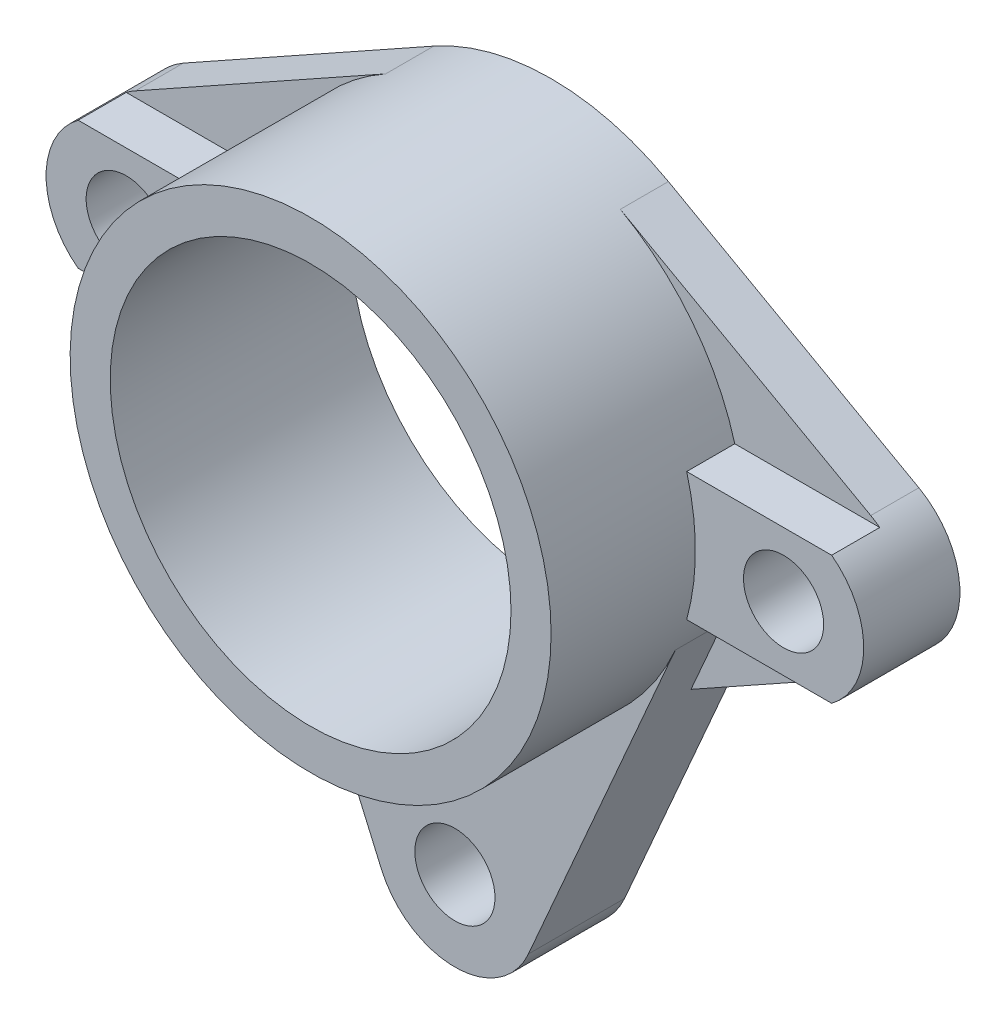
ISO-10303-21;
HEADER;
FILE_DESCRIPTION(('STEP AP214'),'2;1');
FILE_NAME('part.step','',(''),(''),'','','');
FILE_SCHEMA(('AUTOMOTIVE_DESIGN { 1 0 10303 214 1 1 1 1 }'));
ENDSEC;
DATA;
#1=APPLICATION_CONTEXT('core data for automotive mechanical design processes');
#2=APPLICATION_PROTOCOL_DEFINITION('international standard','automotive_design',2000,#1);
#3=PRODUCT_CONTEXT('',#1,'mechanical');
#4=PRODUCT('Part','Part','',(#3));
#5=PRODUCT_RELATED_PRODUCT_CATEGORY('part','',(#4));
#6=PRODUCT_DEFINITION_FORMATION('','',#4);
#7=PRODUCT_DEFINITION_CONTEXT('part definition',#1,'design');
#8=PRODUCT_DEFINITION('design','',#6,#7);
#9=PRODUCT_DEFINITION_SHAPE('','',#8);
#10=(LENGTH_UNIT() NAMED_UNIT(*) SI_UNIT(.MILLI.,.METRE.));
#11=(NAMED_UNIT(*) PLANE_ANGLE_UNIT() SI_UNIT($,.RADIAN.));
#12=(NAMED_UNIT(*) SI_UNIT($,.STERADIAN.) SOLID_ANGLE_UNIT());
#13=UNCERTAINTY_MEASURE_WITH_UNIT(LENGTH_MEASURE(1.E-05),#10,'distance_accuracy_value','');
#14=(GEOMETRIC_REPRESENTATION_CONTEXT(3) GLOBAL_UNCERTAINTY_ASSIGNED_CONTEXT((#13)) GLOBAL_UNIT_ASSIGNED_CONTEXT((#10,
#11,#12)) REPRESENTATION_CONTEXT('',''));
#15=CARTESIAN_POINT('',(0.,0.,0.));
#16=DIRECTION('',(0.,0.,1.));
#17=DIRECTION('',(1.,0.,0.));
#18=AXIS2_PLACEMENT_3D('',#15,#16,#17);
#19=CARTESIAN_POINT('',(0.,8.,12.));
#20=DIRECTION('',(0.,-1.,0.));
#21=DIRECTION('',(0.,0.,-1.));
#22=AXIS2_PLACEMENT_3D('',#19,#20,#21);
#23=PLANE('',#22);
#24=DIRECTION('',(0.,0.,-1.));
#25=VECTOR('',#24,1.);
#26=CARTESIAN_POINT('',(-28.9136645896019,8.,12.));
#27=LINE('',#26,#25);
#28=CARTESIAN_POINT('',(-28.9136645896019,8.,12.));
#29=VERTEX_POINT('',#28);
#30=CARTESIAN_POINT('',(-28.9136645896019,8.,6.));
#31=VERTEX_POINT('',#30);
#32=EDGE_CURVE('E403',#29,#31,#27,.T.);
#33=ORIENTED_EDGE('',*,*,#32,.T.);
#34=DIRECTION('',(-1.,0.,0.));
#35=VECTOR('',#34,1.);
#36=CARTESIAN_POINT('',(0.,8.,6.));
#37=LINE('',#36,#35);
#38=CARTESIAN_POINT('',(-47.,8.,6.));
#39=VERTEX_POINT('',#38);
#40=EDGE_CURVE('E288',#31,#39,#37,.T.);
#41=ORIENTED_EDGE('',*,*,#40,.T.);
#42=DIRECTION('',(0.,0.,-1.));
#43=VECTOR('',#42,1.);
#44=CARTESIAN_POINT('',(-47.,8.,12.));
#45=LINE('',#44,#43);
#46=CARTESIAN_POINT('',(-47.,8.,12.));
#47=VERTEX_POINT('',#46);
#48=EDGE_CURVE('E11',#47,#39,#45,.T.);
#49=ORIENTED_EDGE('',*,*,#48,.F.);
#50=DIRECTION('',(-1.,0.,0.));
#51=VECTOR('',#50,1.);
#52=CARTESIAN_POINT('',(0.,8.,12.));
#53=LINE('',#52,#51);
#54=EDGE_CURVE('E387',#29,#47,#53,.T.);
#55=ORIENTED_EDGE('',*,*,#54,.F.);
#56=EDGE_LOOP('',(#33,#41,#49,#55));
#57=FACE_BOUND('',#56,.T.);
#58=ADVANCED_FACE('F41',(#57),#23,.F.);
#59=CARTESIAN_POINT('',(-41.,0.,12.));
#60=DIRECTION('',(0.,0.,-1.));
#61=DIRECTION('',(-1.,0.,0.));
#62=AXIS2_PLACEMENT_3D('',#59,#60,#61);
#63=CYLINDRICAL_SURFACE('',#62,10.);
#64=CARTESIAN_POINT('',(-41.,0.,0.));
#65=DIRECTION('',(0.,0.,1.));
#66=DIRECTION('',(1.,0.,0.));
#67=AXIS2_PLACEMENT_3D('',#64,#65,#66);
#68=CIRCLE('',#67,10.);
#69=CARTESIAN_POINT('',(-45.8780487804878,8.72952691130404,0.));
#70=VERTEX_POINT('',#69);
#71=CARTESIAN_POINT('',(-45.8780487804878,-8.72952691130405,0.));
#72=VERTEX_POINT('',#71);
#73=EDGE_CURVE('E388',#70,#72,#68,.T.);
#74=ORIENTED_EDGE('',*,*,#73,.T.);
#75=DIRECTION('',(0.,0.,-1.));
#76=VECTOR('',#75,1.);
#77=CARTESIAN_POINT('',(-45.8780487804878,-8.72952691130405,6.));
#78=LINE('',#77,#76);
#79=CARTESIAN_POINT('',(-45.8780487804878,-8.72952691130405,6.));
#80=VERTEX_POINT('',#79);
#81=EDGE_CURVE('E378',#80,#72,#78,.T.);
#82=ORIENTED_EDGE('',*,*,#81,.F.);
#83=CARTESIAN_POINT('',(-41.,0.,6.));
#84=DIRECTION('',(0.,0.,1.));
#85=DIRECTION('',(1.,0.,0.));
#86=AXIS2_PLACEMENT_3D('',#83,#84,#85);
#87=CIRCLE('',#86,10.);
#88=CARTESIAN_POINT('',(-47.,-8.,6.));
#89=VERTEX_POINT('',#88);
#90=EDGE_CURVE('E357',#89,#80,#87,.T.);
#91=ORIENTED_EDGE('',*,*,#90,.F.);
#92=DIRECTION('',(0.,0.,-1.));
#93=VECTOR('',#92,1.);
#94=CARTESIAN_POINT('',(-47.,-8.,12.));
#95=LINE('',#94,#93);
#96=CARTESIAN_POINT('',(-47.,-8.,12.));
#97=VERTEX_POINT('',#96);
#98=EDGE_CURVE('E50',#97,#89,#95,.T.);
#99=ORIENTED_EDGE('',*,*,#98,.F.);
#100=CARTESIAN_POINT('',(-41.,0.,12.));
#101=DIRECTION('',(0.,0.,1.));
#102=DIRECTION('',(1.,0.,0.));
#103=AXIS2_PLACEMENT_3D('',#100,#101,#102);
#104=CIRCLE('',#103,10.);
#105=EDGE_CURVE('E392',#47,#97,#104,.T.);
#106=ORIENTED_EDGE('',*,*,#105,.F.);
#107=ORIENTED_EDGE('',*,*,#48,.T.);
#108=CARTESIAN_POINT('',(-41.,0.,6.));
#109=DIRECTION('',(0.,0.,1.));
#110=DIRECTION('',(1.,0.,0.));
#111=AXIS2_PLACEMENT_3D('',#108,#109,#110);
#112=CIRCLE('',#111,10.);
#113=CARTESIAN_POINT('',(-45.8780487804878,8.72952691130404,6.));
#114=VERTEX_POINT('',#113);
#115=EDGE_CURVE('E284',#114,#39,#112,.T.);
#116=ORIENTED_EDGE('',*,*,#115,.F.);
#117=DIRECTION('',(0.,0.,-1.));
#118=VECTOR('',#117,1.);
#119=CARTESIAN_POINT('',(-45.8780487804878,8.72952691130404,6.));
#120=LINE('',#119,#118);
#121=EDGE_CURVE('E301',#114,#70,#120,.T.);
#122=ORIENTED_EDGE('',*,*,#121,.T.);
#123=EDGE_LOOP('',(#74,#82,#91,#99,#106,#107,#116,#122));
#124=FACE_BOUND('',#123,.T.);
#125=ADVANCED_FACE('F423',(#124),#63,.T.);
#126=CARTESIAN_POINT('',(0.,-8.,12.));
#127=DIRECTION('',(0.,-1.,0.));
#128=DIRECTION('',(1.,0.,0.));
#129=AXIS2_PLACEMENT_3D('',#126,#127,#128);
#130=PLANE('',#129);
#131=DIRECTION('',(-1.,0.,0.));
#132=VECTOR('',#131,1.);
#133=CARTESIAN_POINT('',(0.,-8.,6.));
#134=LINE('',#133,#132);
#135=CARTESIAN_POINT('',(-28.9136645896019,-8.,6.));
#136=VERTEX_POINT('',#135);
#137=EDGE_CURVE('E353',#136,#89,#134,.T.);
#138=ORIENTED_EDGE('',*,*,#137,.F.);
#139=DIRECTION('',(0.,0.,-1.));
#140=VECTOR('',#139,1.);
#141=CARTESIAN_POINT('',(-28.9136645896019,-8.,12.));
#142=LINE('',#141,#140);
#143=CARTESIAN_POINT('',(-28.9136645896019,-8.,12.));
#144=VERTEX_POINT('',#143);
#145=EDGE_CURVE('E411',#144,#136,#142,.T.);
#146=ORIENTED_EDGE('',*,*,#145,.F.);
#147=DIRECTION('',(-1.,0.,0.));
#148=VECTOR('',#147,1.);
#149=CARTESIAN_POINT('',(0.,-8.,12.));
#150=LINE('',#149,#148);
#151=EDGE_CURVE('E395',#144,#97,#150,.T.);
#152=ORIENTED_EDGE('',*,*,#151,.T.);
#153=ORIENTED_EDGE('',*,*,#98,.T.);
#154=EDGE_LOOP('',(#138,#146,#152,#153));
#155=FACE_BOUND('',#154,.T.);
#156=ADVANCED_FACE('F418',(#155),#130,.T.);
#157=CARTESIAN_POINT('',(-41.,0.,12.));
#158=DIRECTION('',(0.,0.,-1.));
#159=DIRECTION('',(-1.,0.,0.));
#160=AXIS2_PLACEMENT_3D('',#157,#158,#159);
#161=CYLINDRICAL_SURFACE('',#160,5.);
#162=CARTESIAN_POINT('',(-41.,0.,12.));
#163=DIRECTION('',(0.,0.,1.));
#164=DIRECTION('',(1.,0.,0.));
#165=AXIS2_PLACEMENT_3D('',#162,#163,#164);
#166=CIRCLE('',#165,5.);
#167=CARTESIAN_POINT('',(-36.,0.,12.));
#168=VERTEX_POINT('',#167);
#169=EDGE_CURVE('E383',#168,#168,#166,.T.);
#170=ORIENTED_EDGE('',*,*,#169,.T.);
#171=EDGE_LOOP('',(#170));
#172=FACE_BOUND('',#171,.T.);
#173=CARTESIAN_POINT('',(-41.,0.,0.));
#174=DIRECTION('',(0.,0.,1.));
#175=DIRECTION('',(1.,0.,0.));
#176=AXIS2_PLACEMENT_3D('',#173,#174,#175);
#177=CIRCLE('',#176,5.);
#178=CARTESIAN_POINT('',(-36.,0.,0.));
#179=VERTEX_POINT('',#178);
#180=EDGE_CURVE('E382',#179,#179,#177,.T.);
#181=ORIENTED_EDGE('',*,*,#180,.F.);
#182=EDGE_LOOP('',(#181));
#183=FACE_BOUND('',#182,.T.);
#184=ADVANCED_FACE('F43',(#172,#183),#161,.F.);
#185=CARTESIAN_POINT('',(0.,0.,12.));
#186=DIRECTION('',(0.,0.,1.));
#187=DIRECTION('',(1.,0.,0.));
#188=AXIS2_PLACEMENT_3D('',#185,#186,#187);
#189=PLANE('',#188);
#190=ORIENTED_EDGE('',*,*,#169,.F.);
#191=EDGE_LOOP('',(#190));
#192=FACE_BOUND('',#191,.T.);
#193=ORIENTED_EDGE('',*,*,#54,.T.);
#194=ORIENTED_EDGE('',*,*,#105,.T.);
#195=ORIENTED_EDGE('',*,*,#151,.F.);
#196=CARTESIAN_POINT('',(0.,0.,12.));
#197=DIRECTION('',(0.,0.,1.));
#198=DIRECTION('',(1.,0.,0.));
#199=AXIS2_PLACEMENT_3D('',#196,#197,#198);
#200=CIRCLE('',#199,30.);
#201=EDGE_CURVE('E399',#29,#144,#200,.T.);
#202=ORIENTED_EDGE('',*,*,#201,.F.);
#203=EDGE_LOOP('',(#193,#194,#195,#202));
#204=FACE_BOUND('',#203,.T.);
#205=ADVANCED_FACE('F431',(#192,#204),#189,.T.);
#206=CARTESIAN_POINT('',(0.,0.,0.));
#207=DIRECTION('',(0.,0.,1.));
#208=DIRECTION('',(1.,0.,0.));
#209=AXIS2_PLACEMENT_3D('',#206,#207,#208);
#210=PLANE('',#209);
#211=ORIENTED_EDGE('',*,*,#180,.T.);
#212=EDGE_LOOP('',(#211));
#213=FACE_BOUND('',#212,.T.);
#214=ORIENTED_EDGE('',*,*,#73,.F.);
#215=DIRECTION('',(0.872952691130404,0.48780487804878,0.));
#216=VECTOR('',#215,1.);
#217=CARTESIAN_POINT('',(-14.6341463414634,26.1885807339121,0.));
#218=LINE('',#217,#216);
#219=CARTESIAN_POINT('',(-14.6341463414634,26.1885807339121,0.));
#220=VERTEX_POINT('',#219);
#221=EDGE_CURVE('E280',#70,#220,#218,.T.);
#222=ORIENTED_EDGE('',*,*,#221,.T.);
#223=CARTESIAN_POINT('',(0.,0.,0.));
#224=DIRECTION('',(0.,0.,1.));
#225=DIRECTION('',(1.,0.,0.));
#226=AXIS2_PLACEMENT_3D('',#223,#224,#225);
#227=CIRCLE('',#226,30.);
#228=CARTESIAN_POINT('',(14.6341463414634,26.1885807339121,0.));
#229=VERTEX_POINT('',#228);
#230=EDGE_CURVE('E701',#229,#220,#227,.T.);
#231=ORIENTED_EDGE('',*,*,#230,.F.);
#232=DIRECTION('',(-0.872952691130404,0.48780487804878,0.));
#233=VECTOR('',#232,1.);
#234=CARTESIAN_POINT('',(14.6341463414634,26.1885807339121,0.));
#235=LINE('',#234,#233);
#236=CARTESIAN_POINT('',(45.8780487804878,8.72952691130405,0.));
#237=VERTEX_POINT('',#236);
#238=EDGE_CURVE('E185',#237,#229,#235,.T.);
#239=ORIENTED_EDGE('',*,*,#238,.F.);
#240=CARTESIAN_POINT('',(41.,0.,0.));
#241=DIRECTION('',(0.,0.,1.));
#242=DIRECTION('',(1.,0.,0.));
#243=AXIS2_PLACEMENT_3D('',#240,#241,#242);
#244=CIRCLE('',#243,10.);
#245=CARTESIAN_POINT('',(45.8780487804878,-8.72952691130403,0.));
#246=VERTEX_POINT('',#245);
#247=EDGE_CURVE('E257',#246,#237,#244,.T.);
#248=ORIENTED_EDGE('',*,*,#247,.F.);
#249=DIRECTION('',(-0.872952691130404,-0.487804878048781,0.));
#250=VECTOR('',#249,1.);
#251=CARTESIAN_POINT('',(14.6341463414634,-26.1885807339121,0.));
#252=LINE('',#251,#250);
#253=CARTESIAN_POINT('',(23.4540446443424,-21.2600325322137,0.));
#254=VERTEX_POINT('',#253);
#255=EDGE_CURVE('E252',#246,#254,#252,.T.);
#256=ORIENTED_EDGE('',*,*,#255,.T.);
#257=DIRECTION('',(0.4,0.916515138991168,0.));
#258=VECTOR('',#257,1.);
#259=CARTESIAN_POINT('',(27.495454169735,-12.,0.));
#260=LINE('',#259,#258);
#261=CARTESIAN_POINT('',(9.16515138991168,-54.,0.));
#262=VERTEX_POINT('',#261);
#263=EDGE_CURVE('E311',#262,#254,#260,.T.);
#264=ORIENTED_EDGE('',*,*,#263,.F.);
#265=CARTESIAN_POINT('',(0.,-50.,0.));
#266=DIRECTION('',(0.,0.,1.));
#267=DIRECTION('',(1.,0.,0.));
#268=AXIS2_PLACEMENT_3D('',#265,#266,#267);
#269=CIRCLE('',#268,10.);
#270=CARTESIAN_POINT('',(-9.16515138991168,-54.,0.));
#271=VERTEX_POINT('',#270);
#272=EDGE_CURVE('E333',#271,#262,#269,.T.);
#273=ORIENTED_EDGE('',*,*,#272,.F.);
#274=DIRECTION('',(-0.4,0.916515138991168,0.));
#275=VECTOR('',#274,1.);
#276=CARTESIAN_POINT('',(-27.495454169735,-12.,0.));
#277=LINE('',#276,#275);
#278=CARTESIAN_POINT('',(-23.4540446443424,-21.2600325322138,0.));
#279=VERTEX_POINT('',#278);
#280=EDGE_CURVE('E329',#271,#279,#277,.T.);
#281=ORIENTED_EDGE('',*,*,#280,.T.);
#282=DIRECTION('',(0.872952691130404,-0.487804878048781,0.));
#283=VECTOR('',#282,1.);
#284=CARTESIAN_POINT('',(-14.6341463414634,-26.1885807339121,0.));
#285=LINE('',#284,#283);
#286=EDGE_CURVE('E352',#72,#279,#285,.T.);
#287=ORIENTED_EDGE('',*,*,#286,.F.);
#288=EDGE_LOOP('',(#214,#222,#231,#239,#248,#256,#264,#273,#281,#287));
#289=FACE_BOUND('',#288,.T.);
#290=CARTESIAN_POINT('',(0.,-50.,0.));
#291=DIRECTION('',(0.,0.,1.));
#292=DIRECTION('',(1.,0.,0.));
#293=AXIS2_PLACEMENT_3D('',#290,#291,#292);
#294=CIRCLE('',#293,5.);
#295=CARTESIAN_POINT('',(5.00000000000001,-50.,0.));
#296=VERTEX_POINT('',#295);
#297=EDGE_CURVE('E305',#296,#296,#294,.T.);
#298=ORIENTED_EDGE('',*,*,#297,.T.);
#299=EDGE_LOOP('',(#298));
#300=FACE_BOUND('',#299,.T.);
#301=CARTESIAN_POINT('',(41.,0.,0.));
#302=DIRECTION('',(0.,0.,1.));
#303=DIRECTION('',(1.,0.,0.));
#304=AXIS2_PLACEMENT_3D('',#301,#302,#303);
#305=CIRCLE('',#304,5.);
#306=CARTESIAN_POINT('',(46.,0.,0.));
#307=VERTEX_POINT('',#306);
#308=EDGE_CURVE('E216',#307,#307,#305,.T.);
#309=ORIENTED_EDGE('',*,*,#308,.T.);
#310=EDGE_LOOP('',(#309));
#311=FACE_BOUND('',#310,.T.);
#312=CARTESIAN_POINT('',(0.,0.,0.));
#313=DIRECTION('',(0.,0.,1.));
#314=DIRECTION('',(1.,0.,0.));
#315=AXIS2_PLACEMENT_3D('',#312,#313,#314);
#316=CIRCLE('',#315,25.);
#317=CARTESIAN_POINT('',(25.,0.,0.));
#318=VERTEX_POINT('',#317);
#319=EDGE_CURVE('E698',#318,#318,#316,.T.);
#320=ORIENTED_EDGE('',*,*,#319,.T.);
#321=EDGE_LOOP('',(#320));
#322=FACE_BOUND('',#321,.T.);
#323=ADVANCED_FACE('F449',(#213,#289,#300,#311,#322),#210,.F.);
#324=CARTESIAN_POINT('',(-14.6341463414634,-26.1885807339121,6.));
#325=DIRECTION('',(0.487804878048781,0.872952691130404,0.));
#326=DIRECTION('',(-0.872952691130404,0.487804878048781,0.));
#327=AXIS2_PLACEMENT_3D('',#324,#325,#326);
#328=PLANE('',#327);
#329=ORIENTED_EDGE('',*,*,#286,.T.);
#330=DIRECTION('',(0.,0.,-1.));
#331=VECTOR('',#330,1.);
#332=CARTESIAN_POINT('',(-23.4540446443424,-21.2600325322138,6.));
#333=LINE('',#332,#331);
#334=CARTESIAN_POINT('',(-23.4540446443424,-21.2600325322138,6.));
#335=VERTEX_POINT('',#334);
#336=EDGE_CURVE('E372',#335,#279,#333,.T.);
#337=ORIENTED_EDGE('',*,*,#336,.F.);
#338=DIRECTION('',(0.872952691130404,-0.487804878048781,0.));
#339=VECTOR('',#338,1.);
#340=CARTESIAN_POINT('',(-14.6341463414634,-26.1885807339121,6.));
#341=LINE('',#340,#339);
#342=EDGE_CURVE('E360',#80,#335,#341,.T.);
#343=ORIENTED_EDGE('',*,*,#342,.F.);
#344=ORIENTED_EDGE('',*,*,#81,.T.);
#345=EDGE_LOOP('',(#329,#337,#343,#344));
#346=FACE_BOUND('',#345,.T.);
#347=ADVANCED_FACE('F447',(#346),#328,.F.);
#348=CARTESIAN_POINT('',(0.,0.,6.));
#349=DIRECTION('',(0.,0.,1.));
#350=DIRECTION('',(1.,0.,0.));
#351=AXIS2_PLACEMENT_3D('',#348,#349,#350);
#352=PLANE('',#351);
#353=ORIENTED_EDGE('',*,*,#137,.T.);
#354=ORIENTED_EDGE('',*,*,#90,.T.);
#355=ORIENTED_EDGE('',*,*,#342,.T.);
#356=DIRECTION('',(-0.4,0.916515138991168,0.));
#357=VECTOR('',#356,1.);
#358=CARTESIAN_POINT('',(-27.495454169735,-12.,6.));
#359=LINE('',#358,#357);
#360=CARTESIAN_POINT('',(-27.495454169735,-12.,6.));
#361=VERTEX_POINT('',#360);
#362=EDGE_CURVE('E364',#335,#361,#359,.T.);
#363=ORIENTED_EDGE('',*,*,#362,.T.);
#364=CARTESIAN_POINT('',(0.,0.,6.));
#365=DIRECTION('',(0.,0.,1.));
#366=DIRECTION('',(1.,0.,0.));
#367=AXIS2_PLACEMENT_3D('',#364,#365,#366);
#368=CIRCLE('',#367,30.);
#369=EDGE_CURVE('E368',#136,#361,#368,.T.);
#370=ORIENTED_EDGE('',*,*,#369,.F.);
#371=EDGE_LOOP('',(#353,#354,#355,#363,#370));
#372=FACE_BOUND('',#371,.T.);
#373=ADVANCED_FACE('F426',(#372),#352,.T.);
#374=CARTESIAN_POINT('',(-27.495454169735,-12.,12.));
#375=DIRECTION('',(-0.916515138991168,-0.4,0.));
#376=DIRECTION('',(0.4,-0.916515138991168,0.));
#377=AXIS2_PLACEMENT_3D('',#374,#375,#376);
#378=PLANE('',#377);
#379=ORIENTED_EDGE('',*,*,#336,.T.);
#380=ORIENTED_EDGE('',*,*,#280,.F.);
#381=DIRECTION('',(0.,0.,-1.));
#382=VECTOR('',#381,1.);
#383=CARTESIAN_POINT('',(-9.16515138991168,-54.,12.));
#384=LINE('',#383,#382);
#385=CARTESIAN_POINT('',(-9.16515138991168,-54.,12.));
#386=VERTEX_POINT('',#385);
#387=EDGE_CURVE('E349',#386,#271,#384,.T.);
#388=ORIENTED_EDGE('',*,*,#387,.F.);
#389=DIRECTION('',(-0.4,0.916515138991168,0.));
#390=VECTOR('',#389,1.);
#391=CARTESIAN_POINT('',(-27.495454169735,-12.,12.));
#392=LINE('',#391,#390);
#393=CARTESIAN_POINT('',(-27.495454169735,-12.,12.));
#394=VERTEX_POINT('',#393);
#395=EDGE_CURVE('E310',#386,#394,#392,.T.);
#396=ORIENTED_EDGE('',*,*,#395,.T.);
#397=DIRECTION('',(0.,0.,-1.));
#398=VECTOR('',#397,1.);
#399=CARTESIAN_POINT('',(-27.495454169735,-12.,12.));
#400=LINE('',#399,#398);
#401=EDGE_CURVE('E325',#394,#361,#400,.T.);
#402=ORIENTED_EDGE('',*,*,#401,.T.);
#403=ORIENTED_EDGE('',*,*,#362,.F.);
#404=EDGE_LOOP('',(#379,#380,#388,#396,#402,#403));
#405=FACE_BOUND('',#404,.T.);
#406=ADVANCED_FACE('F454',(#405),#378,.T.);
#407=CARTESIAN_POINT('',(0.,-50.,12.));
#408=DIRECTION('',(0.,0.,-1.));
#409=DIRECTION('',(-1.,0.,0.));
#410=AXIS2_PLACEMENT_3D('',#407,#408,#409);
#411=CYLINDRICAL_SURFACE('',#410,10.);
#412=ORIENTED_EDGE('',*,*,#272,.T.);
#413=DIRECTION('',(0.,0.,-1.));
#414=VECTOR('',#413,1.);
#415=CARTESIAN_POINT('',(9.16515138991168,-54.,12.));
#416=LINE('',#415,#414);
#417=CARTESIAN_POINT('',(9.16515138991168,-54.,12.));
#418=VERTEX_POINT('',#417);
#419=EDGE_CURVE('E345',#418,#262,#416,.T.);
#420=ORIENTED_EDGE('',*,*,#419,.F.);
#421=CARTESIAN_POINT('',(0.,-50.,12.));
#422=DIRECTION('',(0.,0.,1.));
#423=DIRECTION('',(1.,0.,0.));
#424=AXIS2_PLACEMENT_3D('',#421,#422,#423);
#425=CIRCLE('',#424,10.);
#426=EDGE_CURVE('E314',#386,#418,#425,.T.);
#427=ORIENTED_EDGE('',*,*,#426,.F.);
#428=ORIENTED_EDGE('',*,*,#387,.T.);
#429=EDGE_LOOP('',(#412,#420,#427,#428));
#430=FACE_BOUND('',#429,.T.);
#431=ADVANCED_FACE('F464',(#430),#411,.T.);
#432=CARTESIAN_POINT('',(27.495454169735,-12.,12.));
#433=DIRECTION('',(-0.916515138991168,0.4,0.));
#434=DIRECTION('',(-0.4,-0.916515138991168,0.));
#435=AXIS2_PLACEMENT_3D('',#432,#433,#434);
#436=PLANE('',#435);
#437=ORIENTED_EDGE('',*,*,#263,.T.);
#438=DIRECTION('',(0.,0.,-1.));
#439=VECTOR('',#438,1.);
#440=CARTESIAN_POINT('',(23.4540446443424,-21.2600325322137,6.));
#441=LINE('',#440,#439);
#442=CARTESIAN_POINT('',(23.4540446443424,-21.2600325322137,6.));
#443=VERTEX_POINT('',#442);
#444=EDGE_CURVE('E57',#443,#254,#441,.T.);
#445=ORIENTED_EDGE('',*,*,#444,.F.);
#446=DIRECTION('',(0.4,0.916515138991168,0.));
#447=VECTOR('',#446,1.);
#448=CARTESIAN_POINT('',(27.495454169735,-12.,6.));
#449=LINE('',#448,#447);
#450=CARTESIAN_POINT('',(27.495454169735,-12.,6.));
#451=VERTEX_POINT('',#450);
#452=EDGE_CURVE('E62',#443,#451,#449,.T.);
#453=ORIENTED_EDGE('',*,*,#452,.T.);
#454=DIRECTION('',(0.,0.,-1.));
#455=VECTOR('',#454,1.);
#456=CARTESIAN_POINT('',(27.495454169735,-12.,12.));
#457=LINE('',#456,#455);
#458=CARTESIAN_POINT('',(27.495454169735,-12.,12.));
#459=VERTEX_POINT('',#458);
#460=EDGE_CURVE('E341',#459,#451,#457,.T.);
#461=ORIENTED_EDGE('',*,*,#460,.F.);
#462=DIRECTION('',(0.4,0.916515138991168,0.));
#463=VECTOR('',#462,1.);
#464=CARTESIAN_POINT('',(27.495454169735,-12.,12.));
#465=LINE('',#464,#463);
#466=EDGE_CURVE('E318',#418,#459,#465,.T.);
#467=ORIENTED_EDGE('',*,*,#466,.F.);
#468=ORIENTED_EDGE('',*,*,#419,.T.);
#469=EDGE_LOOP('',(#437,#445,#453,#461,#467,#468));
#470=FACE_BOUND('',#469,.T.);
#471=ADVANCED_FACE('F461',(#470),#436,.F.);
#472=CARTESIAN_POINT('',(0.,-50.,12.));
#473=DIRECTION('',(0.,0.,-1.));
#474=DIRECTION('',(-1.,0.,0.));
#475=AXIS2_PLACEMENT_3D('',#472,#473,#474);
#476=CYLINDRICAL_SURFACE('',#475,5.);
#477=CARTESIAN_POINT('',(0.,-50.,12.));
#478=DIRECTION('',(0.,0.,1.));
#479=DIRECTION('',(1.,0.,0.));
#480=AXIS2_PLACEMENT_3D('',#477,#478,#479);
#481=CIRCLE('',#480,5.);
#482=CARTESIAN_POINT('',(5.00000000000001,-50.,12.));
#483=VERTEX_POINT('',#482);
#484=EDGE_CURVE('E306',#483,#483,#481,.T.);
#485=ORIENTED_EDGE('',*,*,#484,.T.);
#486=EDGE_LOOP('',(#485));
#487=FACE_BOUND('',#486,.T.);
#488=ORIENTED_EDGE('',*,*,#297,.F.);
#489=EDGE_LOOP('',(#488));
#490=FACE_BOUND('',#489,.T.);
#491=ADVANCED_FACE('F463',(#487,#490),#476,.F.);
#492=CARTESIAN_POINT('',(0.,0.,12.));
#493=DIRECTION('',(0.,0.,1.));
#494=DIRECTION('',(1.,0.,0.));
#495=AXIS2_PLACEMENT_3D('',#492,#493,#494);
#496=PLANE('',#495);
#497=ORIENTED_EDGE('',*,*,#484,.F.);
#498=EDGE_LOOP('',(#497));
#499=FACE_BOUND('',#498,.T.);
#500=ORIENTED_EDGE('',*,*,#395,.F.);
#501=ORIENTED_EDGE('',*,*,#426,.T.);
#502=ORIENTED_EDGE('',*,*,#466,.T.);
#503=CARTESIAN_POINT('',(0.,0.,12.));
#504=DIRECTION('',(0.,0.,1.));
#505=DIRECTION('',(1.,0.,0.));
#506=AXIS2_PLACEMENT_3D('',#503,#504,#505);
#507=CIRCLE('',#506,30.);
#508=EDGE_CURVE('E321',#394,#459,#507,.T.);
#509=ORIENTED_EDGE('',*,*,#508,.F.);
#510=EDGE_LOOP('',(#500,#501,#502,#509));
#511=FACE_BOUND('',#510,.T.);
#512=ADVANCED_FACE('F459',(#499,#511),#496,.T.);
#513=CARTESIAN_POINT('',(-14.6341463414634,26.1885807339121,6.));
#514=DIRECTION('',(-0.48780487804878,0.872952691130404,0.));
#515=DIRECTION('',(-0.872952691130404,-0.48780487804878,0.));
#516=AXIS2_PLACEMENT_3D('',#513,#514,#515);
#517=PLANE('',#516);
#518=ORIENTED_EDGE('',*,*,#221,.F.);
#519=ORIENTED_EDGE('',*,*,#121,.F.);
#520=DIRECTION('',(0.872952691130404,0.48780487804878,0.));
#521=VECTOR('',#520,1.);
#522=CARTESIAN_POINT('',(-14.6341463414634,26.1885807339121,6.));
#523=LINE('',#522,#521);
#524=CARTESIAN_POINT('',(-14.6341463414634,26.1885807339121,6.));
#525=VERTEX_POINT('',#524);
#526=EDGE_CURVE('E281',#114,#525,#523,.T.);
#527=ORIENTED_EDGE('',*,*,#526,.T.);
#528=DIRECTION('',(0.,0.,-1.));
#529=VECTOR('',#528,1.);
#530=CARTESIAN_POINT('',(-14.6341463414634,26.1885807339121,6.));
#531=LINE('',#530,#529);
#532=EDGE_CURVE('E295',#525,#220,#531,.T.);
#533=ORIENTED_EDGE('',*,*,#532,.T.);
#534=EDGE_LOOP('',(#518,#519,#527,#533));
#535=FACE_BOUND('',#534,.T.);
#536=ADVANCED_FACE('F443',(#535),#517,.T.);
#537=CARTESIAN_POINT('',(0.,0.,6.));
#538=DIRECTION('',(0.,0.,1.));
#539=DIRECTION('',(1.,0.,0.));
#540=AXIS2_PLACEMENT_3D('',#537,#538,#539);
#541=PLANE('',#540);
#542=ORIENTED_EDGE('',*,*,#526,.F.);
#543=ORIENTED_EDGE('',*,*,#115,.T.);
#544=ORIENTED_EDGE('',*,*,#40,.F.);
#545=CARTESIAN_POINT('',(0.,0.,6.));
#546=DIRECTION('',(0.,0.,1.));
#547=DIRECTION('',(1.,0.,0.));
#548=AXIS2_PLACEMENT_3D('',#545,#546,#547);
#549=CIRCLE('',#548,30.);
#550=EDGE_CURVE('E291',#525,#31,#549,.T.);
#551=ORIENTED_EDGE('',*,*,#550,.F.);
#552=EDGE_LOOP('',(#542,#543,#544,#551));
#553=FACE_BOUND('',#552,.T.);
#554=ADVANCED_FACE('F438',(#553),#541,.T.);
#555=CARTESIAN_POINT('',(14.6341463414634,-26.1885807339121,6.));
#556=DIRECTION('',(0.487804878048781,-0.872952691130404,0.));
#557=DIRECTION('',(0.872952691130404,0.487804878048781,0.));
#558=AXIS2_PLACEMENT_3D('',#555,#556,#557);
#559=PLANE('',#558);
#560=ORIENTED_EDGE('',*,*,#255,.F.);
#561=DIRECTION('',(0.,0.,-1.));
#562=VECTOR('',#561,1.);
#563=CARTESIAN_POINT('',(45.8780487804878,-8.72952691130403,6.));
#564=LINE('',#563,#562);
#565=CARTESIAN_POINT('',(45.8780487804878,-8.72952691130403,6.));
#566=VERTEX_POINT('',#565);
#567=EDGE_CURVE('E277',#566,#246,#564,.T.);
#568=ORIENTED_EDGE('',*,*,#567,.F.);
#569=DIRECTION('',(-0.872952691130404,-0.487804878048781,0.));
#570=VECTOR('',#569,1.);
#571=CARTESIAN_POINT('',(14.6341463414634,-26.1885807339121,6.));
#572=LINE('',#571,#570);
#573=EDGE_CURVE('E253',#566,#443,#572,.T.);
#574=ORIENTED_EDGE('',*,*,#573,.T.);
#575=ORIENTED_EDGE('',*,*,#444,.T.);
#576=EDGE_LOOP('',(#560,#568,#574,#575));
#577=FACE_BOUND('',#576,.T.);
#578=ADVANCED_FACE('F520',(#577),#559,.T.);
#579=CARTESIAN_POINT('',(41.,0.,6.));
#580=DIRECTION('',(0.,0.,-1.));
#581=DIRECTION('',(-1.,0.,0.));
#582=AXIS2_PLACEMENT_3D('',#579,#580,#581);
#583=CYLINDRICAL_SURFACE('',#582,10.);
#584=ORIENTED_EDGE('',*,*,#247,.T.);
#585=DIRECTION('',(0.,0.,-1.));
#586=VECTOR('',#585,1.);
#587=CARTESIAN_POINT('',(45.8780487804878,8.72952691130405,6.));
#588=LINE('',#587,#586);
#589=CARTESIAN_POINT('',(45.8780487804878,8.72952691130405,6.));
#590=VERTEX_POINT('',#589);
#591=EDGE_CURVE('E191',#590,#237,#588,.T.);
#592=ORIENTED_EDGE('',*,*,#591,.F.);
#593=CARTESIAN_POINT('',(41.,0.,6.));
#594=DIRECTION('',(0.,0.,1.));
#595=DIRECTION('',(1.,0.,0.));
#596=AXIS2_PLACEMENT_3D('',#593,#594,#595);
#597=CIRCLE('',#596,10.);
#598=CARTESIAN_POINT('',(47.,8.,6.));
#599=VERTEX_POINT('',#598);
#600=EDGE_CURVE('E198',#599,#590,#597,.T.);
#601=ORIENTED_EDGE('',*,*,#600,.F.);
#602=DIRECTION('',(0.,0.,-1.));
#603=VECTOR('',#602,1.);
#604=CARTESIAN_POINT('',(47.,8.,12.));
#605=LINE('',#604,#603);
#606=CARTESIAN_POINT('',(47.,8.,12.));
#607=VERTEX_POINT('',#606);
#608=EDGE_CURVE('E244',#607,#599,#605,.T.);
#609=ORIENTED_EDGE('',*,*,#608,.F.);
#610=CARTESIAN_POINT('',(41.,0.,12.));
#611=DIRECTION('',(0.,0.,1.));
#612=DIRECTION('',(1.,0.,0.));
#613=AXIS2_PLACEMENT_3D('',#610,#611,#612);
#614=CIRCLE('',#613,10.);
#615=CARTESIAN_POINT('',(47.,-8.,12.));
#616=VERTEX_POINT('',#615);
#617=EDGE_CURVE('E225',#616,#607,#614,.T.);
#618=ORIENTED_EDGE('',*,*,#617,.F.);
#619=DIRECTION('',(0.,0.,-1.));
#620=VECTOR('',#619,1.);
#621=CARTESIAN_POINT('',(47.,-8.,12.));
#622=LINE('',#621,#620);
#623=CARTESIAN_POINT('',(47.,-8.,6.));
#624=VERTEX_POINT('',#623);
#625=EDGE_CURVE('E248',#616,#624,#622,.T.);
#626=ORIENTED_EDGE('',*,*,#625,.T.);
#627=CARTESIAN_POINT('',(41.,0.,6.));
#628=DIRECTION('',(0.,0.,1.));
#629=DIRECTION('',(1.,0.,0.));
#630=AXIS2_PLACEMENT_3D('',#627,#628,#629);
#631=CIRCLE('',#630,10.);
#632=EDGE_CURVE('E256',#566,#624,#631,.T.);
#633=ORIENTED_EDGE('',*,*,#632,.F.);
#634=ORIENTED_EDGE('',*,*,#567,.T.);
#635=EDGE_LOOP('',(#584,#592,#601,#609,#618,#626,#633,#634));
#636=FACE_BOUND('',#635,.T.);
#637=ADVANCED_FACE('F525',(#636),#583,.T.);
#638=CARTESIAN_POINT('',(0.,0.,6.));
#639=DIRECTION('',(0.,0.,1.));
#640=DIRECTION('',(1.,0.,0.));
#641=AXIS2_PLACEMENT_3D('',#638,#639,#640);
#642=PLANE('',#641);
#643=ORIENTED_EDGE('',*,*,#573,.F.);
#644=ORIENTED_EDGE('',*,*,#632,.T.);
#645=DIRECTION('',(1.,0.,0.));
#646=VECTOR('',#645,1.);
#647=CARTESIAN_POINT('',(0.,-8.,6.));
#648=LINE('',#647,#646);
#649=CARTESIAN_POINT('',(28.9136645896019,-8.,6.));
#650=VERTEX_POINT('',#649);
#651=EDGE_CURVE('E260',#650,#624,#648,.T.);
#652=ORIENTED_EDGE('',*,*,#651,.F.);
#653=CARTESIAN_POINT('',(0.,0.,6.));
#654=DIRECTION('',(0.,0.,1.));
#655=DIRECTION('',(1.,0.,0.));
#656=AXIS2_PLACEMENT_3D('',#653,#654,#655);
#657=CIRCLE('',#656,30.);
#658=EDGE_CURVE('E264',#451,#650,#657,.T.);
#659=ORIENTED_EDGE('',*,*,#658,.F.);
#660=ORIENTED_EDGE('',*,*,#452,.F.);
#661=EDGE_LOOP('',(#643,#644,#652,#659,#660));
#662=FACE_BOUND('',#661,.T.);
#663=ADVANCED_FACE('F538',(#662),#642,.T.);
#664=CARTESIAN_POINT('',(0.,-8.,12.));
#665=DIRECTION('',(0.,1.,0.));
#666=DIRECTION('',(0.,0.,1.));
#667=AXIS2_PLACEMENT_3D('',#664,#665,#666);
#668=PLANE('',#667);
#669=ORIENTED_EDGE('',*,*,#651,.T.);
#670=ORIENTED_EDGE('',*,*,#625,.F.);
#671=DIRECTION('',(1.,0.,0.));
#672=VECTOR('',#671,1.);
#673=CARTESIAN_POINT('',(0.,-8.,12.));
#674=LINE('',#673,#672);
#675=CARTESIAN_POINT('',(28.9136645896019,-8.,12.));
#676=VERTEX_POINT('',#675);
#677=EDGE_CURVE('E221',#676,#616,#674,.T.);
#678=ORIENTED_EDGE('',*,*,#677,.F.);
#679=DIRECTION('',(0.,0.,-1.));
#680=VECTOR('',#679,1.);
#681=CARTESIAN_POINT('',(28.9136645896019,-8.,12.));
#682=LINE('',#681,#680);
#683=EDGE_CURVE('E235',#676,#650,#682,.T.);
#684=ORIENTED_EDGE('',*,*,#683,.T.);
#685=EDGE_LOOP('',(#669,#670,#678,#684));
#686=FACE_BOUND('',#685,.T.);
#687=ADVANCED_FACE('F613',(#686),#668,.F.);
#688=CARTESIAN_POINT('',(0.,8.,12.));
#689=DIRECTION('',(0.,1.,0.));
#690=DIRECTION('',(0.,0.,1.));
#691=AXIS2_PLACEMENT_3D('',#688,#689,#690);
#692=PLANE('',#691);
#693=DIRECTION('',(1.,0.,0.));
#694=VECTOR('',#693,1.);
#695=CARTESIAN_POINT('',(0.,8.,6.));
#696=LINE('',#695,#694);
#697=CARTESIAN_POINT('',(28.9136645896019,8.,6.));
#698=VERTEX_POINT('',#697);
#699=EDGE_CURVE('E211',#698,#599,#696,.T.);
#700=ORIENTED_EDGE('',*,*,#699,.F.);
#701=DIRECTION('',(0.,0.,-1.));
#702=VECTOR('',#701,1.);
#703=CARTESIAN_POINT('',(28.9136645896019,8.,12.));
#704=LINE('',#703,#702);
#705=CARTESIAN_POINT('',(28.9136645896019,8.,12.));
#706=VERTEX_POINT('',#705);
#707=EDGE_CURVE('E205',#706,#698,#704,.T.);
#708=ORIENTED_EDGE('',*,*,#707,.F.);
#709=DIRECTION('',(1.,0.,0.));
#710=VECTOR('',#709,1.);
#711=CARTESIAN_POINT('',(0.,8.,12.));
#712=LINE('',#711,#710);
#713=EDGE_CURVE('E228',#706,#607,#712,.T.);
#714=ORIENTED_EDGE('',*,*,#713,.T.);
#715=ORIENTED_EDGE('',*,*,#608,.T.);
#716=EDGE_LOOP('',(#700,#708,#714,#715));
#717=FACE_BOUND('',#716,.T.);
#718=ADVANCED_FACE('F551',(#717),#692,.T.);
#719=CARTESIAN_POINT('',(41.,0.,12.));
#720=DIRECTION('',(0.,0.,-1.));
#721=DIRECTION('',(-1.,0.,0.));
#722=AXIS2_PLACEMENT_3D('',#719,#720,#721);
#723=CYLINDRICAL_SURFACE('',#722,5.);
#724=CARTESIAN_POINT('',(41.,0.,12.));
#725=DIRECTION('',(0.,0.,1.));
#726=DIRECTION('',(1.,0.,0.));
#727=AXIS2_PLACEMENT_3D('',#724,#725,#726);
#728=CIRCLE('',#727,5.);
#729=CARTESIAN_POINT('',(46.,0.,12.));
#730=VERTEX_POINT('',#729);
#731=EDGE_CURVE('E217',#730,#730,#728,.T.);
#732=ORIENTED_EDGE('',*,*,#731,.T.);
#733=EDGE_LOOP('',(#732));
#734=FACE_BOUND('',#733,.T.);
#735=ORIENTED_EDGE('',*,*,#308,.F.);
#736=EDGE_LOOP('',(#735));
#737=FACE_BOUND('',#736,.T.);
#738=ADVANCED_FACE('F546',(#734,#737),#723,.F.);
#739=CARTESIAN_POINT('',(0.,0.,12.));
#740=DIRECTION('',(0.,0.,1.));
#741=DIRECTION('',(1.,0.,0.));
#742=AXIS2_PLACEMENT_3D('',#739,#740,#741);
#743=PLANE('',#742);
#744=ORIENTED_EDGE('',*,*,#731,.F.);
#745=EDGE_LOOP('',(#744));
#746=FACE_BOUND('',#745,.T.);
#747=ORIENTED_EDGE('',*,*,#677,.T.);
#748=ORIENTED_EDGE('',*,*,#617,.T.);
#749=ORIENTED_EDGE('',*,*,#713,.F.);
#750=CARTESIAN_POINT('',(0.,0.,12.));
#751=DIRECTION('',(0.,0.,1.));
#752=DIRECTION('',(1.,0.,0.));
#753=AXIS2_PLACEMENT_3D('',#750,#751,#752);
#754=CIRCLE('',#753,30.);
#755=EDGE_CURVE('E232',#676,#706,#754,.T.);
#756=ORIENTED_EDGE('',*,*,#755,.F.);
#757=EDGE_LOOP('',(#747,#748,#749,#756));
#758=FACE_BOUND('',#757,.T.);
#759=ADVANCED_FACE('F550',(#746,#758),#743,.T.);
#760=CARTESIAN_POINT('',(14.6341463414634,26.1885807339121,6.));
#761=DIRECTION('',(-0.48780487804878,-0.872952691130404,0.));
#762=DIRECTION('',(0.872952691130404,-0.48780487804878,0.));
#763=AXIS2_PLACEMENT_3D('',#760,#761,#762);
#764=PLANE('',#763);
#765=ORIENTED_EDGE('',*,*,#238,.T.);
#766=DIRECTION('',(0.,0.,-1.));
#767=VECTOR('',#766,1.);
#768=CARTESIAN_POINT('',(14.6341463414634,26.1885807339121,6.));
#769=LINE('',#768,#767);
#770=CARTESIAN_POINT('',(14.6341463414634,26.1885807339121,6.));
#771=VERTEX_POINT('',#770);
#772=EDGE_CURVE('E179',#771,#229,#769,.T.);
#773=ORIENTED_EDGE('',*,*,#772,.F.);
#774=DIRECTION('',(-0.872952691130404,0.48780487804878,0.));
#775=VECTOR('',#774,1.);
#776=CARTESIAN_POINT('',(14.6341463414634,26.1885807339121,6.));
#777=LINE('',#776,#775);
#778=EDGE_CURVE('E183',#590,#771,#777,.T.);
#779=ORIENTED_EDGE('',*,*,#778,.F.);
#780=ORIENTED_EDGE('',*,*,#591,.T.);
#781=EDGE_LOOP('',(#765,#773,#779,#780));
#782=FACE_BOUND('',#781,.T.);
#783=ADVANCED_FACE('F181',(#782),#764,.F.);
#784=CARTESIAN_POINT('',(0.,0.,6.));
#785=DIRECTION('',(0.,0.,1.));
#786=DIRECTION('',(1.,0.,0.));
#787=AXIS2_PLACEMENT_3D('',#784,#785,#786);
#788=PLANE('',#787);
#789=ORIENTED_EDGE('',*,*,#699,.T.);
#790=ORIENTED_EDGE('',*,*,#600,.T.);
#791=ORIENTED_EDGE('',*,*,#778,.T.);
#792=CARTESIAN_POINT('',(0.,0.,6.));
#793=DIRECTION('',(0.,0.,1.));
#794=DIRECTION('',(1.,0.,0.));
#795=AXIS2_PLACEMENT_3D('',#792,#793,#794);
#796=CIRCLE('',#795,30.);
#797=EDGE_CURVE('E192',#698,#771,#796,.T.);
#798=ORIENTED_EDGE('',*,*,#797,.F.);
#799=EDGE_LOOP('',(#789,#790,#791,#798));
#800=FACE_BOUND('',#799,.T.);
#801=ADVANCED_FACE('F196',(#800),#788,.T.);
#802=CARTESIAN_POINT('',(0.,0.,30.));
#803=DIRECTION('',(0.,0.,-1.));
#804=DIRECTION('',(-1.,0.,0.));
#805=AXIS2_PLACEMENT_3D('',#802,#803,#804);
#806=CYLINDRICAL_SURFACE('',#805,30.);
#807=CARTESIAN_POINT('',(0.,0.,30.));
#808=DIRECTION('',(0.,0.,1.));
#809=DIRECTION('',(1.,0.,0.));
#810=AXIS2_PLACEMENT_3D('',#807,#808,#809);
#811=CIRCLE('',#810,30.);
#812=CARTESIAN_POINT('',(30.,0.,30.));
#813=VERTEX_POINT('',#812);
#814=EDGE_CURVE('E212',#813,#813,#811,.T.);
#815=ORIENTED_EDGE('',*,*,#814,.F.);
#816=EDGE_LOOP('',(#815));
#817=FACE_BOUND('',#816,.T.);
#818=ORIENTED_EDGE('',*,*,#230,.T.);
#819=ORIENTED_EDGE('',*,*,#532,.F.);
#820=ORIENTED_EDGE('',*,*,#550,.T.);
#821=ORIENTED_EDGE('',*,*,#32,.F.);
#822=ORIENTED_EDGE('',*,*,#201,.T.);
#823=ORIENTED_EDGE('',*,*,#145,.T.);
#824=ORIENTED_EDGE('',*,*,#369,.T.);
#825=ORIENTED_EDGE('',*,*,#401,.F.);
#826=ORIENTED_EDGE('',*,*,#508,.T.);
#827=ORIENTED_EDGE('',*,*,#460,.T.);
#828=ORIENTED_EDGE('',*,*,#658,.T.);
#829=ORIENTED_EDGE('',*,*,#683,.F.);
#830=ORIENTED_EDGE('',*,*,#755,.T.);
#831=ORIENTED_EDGE('',*,*,#707,.T.);
#832=ORIENTED_EDGE('',*,*,#797,.T.);
#833=ORIENTED_EDGE('',*,*,#772,.T.);
#834=EDGE_LOOP('',(#818,#819,#820,#821,#822,#823,#824,#825,#826,#827,#828,#829,#830,#831,#832,#833));
#835=FACE_BOUND('',#834,.T.);
#836=ADVANCED_FACE('F203',(#817,#835),#806,.T.);
#837=CARTESIAN_POINT('',(0.,0.,30.));
#838=DIRECTION('',(0.,0.,-1.));
#839=DIRECTION('',(-1.,0.,0.));
#840=AXIS2_PLACEMENT_3D('',#837,#838,#839);
#841=CYLINDRICAL_SURFACE('',#840,25.);
#842=CARTESIAN_POINT('',(0.,0.,30.));
#843=DIRECTION('',(0.,0.,1.));
#844=DIRECTION('',(1.,0.,0.));
#845=AXIS2_PLACEMENT_3D('',#842,#843,#844);
#846=CIRCLE('',#845,25.);
#847=CARTESIAN_POINT('',(25.,0.,30.));
#848=VERTEX_POINT('',#847);
#849=EDGE_CURVE('E704',#848,#848,#846,.T.);
#850=ORIENTED_EDGE('',*,*,#849,.T.);
#851=EDGE_LOOP('',(#850));
#852=FACE_BOUND('',#851,.T.);
#853=ORIENTED_EDGE('',*,*,#319,.F.);
#854=EDGE_LOOP('',(#853));
#855=FACE_BOUND('',#854,.T.);
#856=ADVANCED_FACE('F662',(#852,#855),#841,.F.);
#857=CARTESIAN_POINT('',(0.,0.,30.));
#858=DIRECTION('',(0.,0.,1.));
#859=DIRECTION('',(1.,0.,0.));
#860=AXIS2_PLACEMENT_3D('',#857,#858,#859);
#861=PLANE('',#860);
#862=ORIENTED_EDGE('',*,*,#849,.F.);
#863=EDGE_LOOP('',(#862));
#864=FACE_BOUND('',#863,.T.);
#865=ORIENTED_EDGE('',*,*,#814,.T.);
#866=EDGE_LOOP('',(#865));
#867=FACE_BOUND('',#866,.T.);
#868=ADVANCED_FACE('F672',(#864,#867),#861,.T.);
#869=CLOSED_SHELL('',(#58,#125,#156,#184,#205,#323,#347,#373,#406,#431,#471,#491,#512,#536,#554,
#578,#637,#663,#687,#718,#738,#759,#783,#801,#836,#856,#868));
#870=MANIFOLD_SOLID_BREP('B2',#869);
#871=ADVANCED_BREP_SHAPE_REPRESENTATION('',(#18,#870),#14);
#872=SHAPE_DEFINITION_REPRESENTATION(#9,#871);
ENDSEC;
END-ISO-10303-21;
